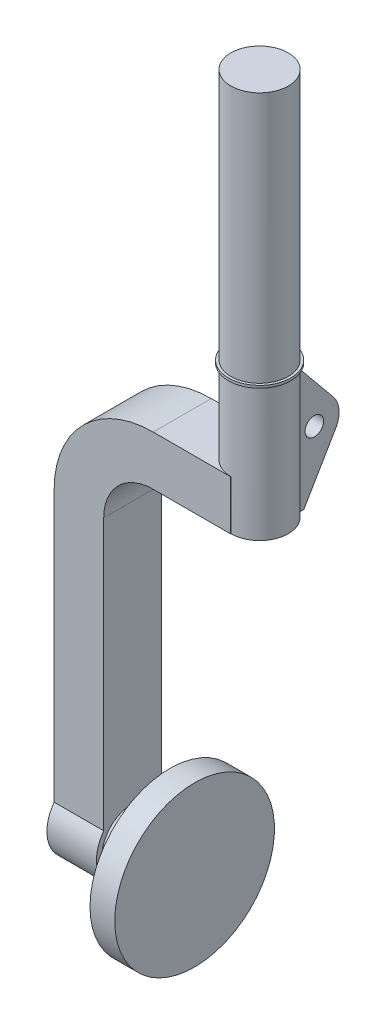
ISO-10303-21;
HEADER;
FILE_DESCRIPTION(('STEP AP214'),'2;1');
FILE_NAME('part.step','',(''),(''),'','','');
FILE_SCHEMA(('AUTOMOTIVE_DESIGN { 1 0 10303 214 1 1 1 1 }'));
ENDSEC;
DATA;
#1=APPLICATION_CONTEXT('core data for automotive mechanical design processes');
#2=APPLICATION_PROTOCOL_DEFINITION('international standard','automotive_design',2000,#1);
#3=PRODUCT_CONTEXT('',#1,'mechanical');
#4=PRODUCT('Part','Part','',(#3));
#5=PRODUCT_RELATED_PRODUCT_CATEGORY('part','',(#4));
#6=PRODUCT_DEFINITION_FORMATION('','',#4);
#7=PRODUCT_DEFINITION_CONTEXT('part definition',#1,'design');
#8=PRODUCT_DEFINITION('design','',#6,#7);
#9=PRODUCT_DEFINITION_SHAPE('','',#8);
#10=(LENGTH_UNIT() NAMED_UNIT(*) SI_UNIT(.MILLI.,.METRE.));
#11=(NAMED_UNIT(*) PLANE_ANGLE_UNIT() SI_UNIT($,.RADIAN.));
#12=(NAMED_UNIT(*) SI_UNIT($,.STERADIAN.) SOLID_ANGLE_UNIT());
#13=UNCERTAINTY_MEASURE_WITH_UNIT(LENGTH_MEASURE(1.E-05),#10,'distance_accuracy_value','');
#14=(GEOMETRIC_REPRESENTATION_CONTEXT(3) GLOBAL_UNCERTAINTY_ASSIGNED_CONTEXT((#13)) GLOBAL_UNIT_ASSIGNED_CONTEXT((#10,
#11,#12)) REPRESENTATION_CONTEXT('',''));
#15=CARTESIAN_POINT('',(0.,0.,0.));
#16=DIRECTION('',(0.,0.,1.));
#17=DIRECTION('',(1.,0.,0.));
#18=AXIS2_PLACEMENT_3D('',#15,#16,#17);
#19=CARTESIAN_POINT('',(15.8749999999999,200.9775,29.765625));
#20=DIRECTION('',(-1.,0.,0.));
#21=DIRECTION('',(0.,0.,1.));
#22=AXIS2_PLACEMENT_3D('',#19,#20,#21);
#23=PLANE('',#22);
#24=DIRECTION('',(0.,0.862458531784219,-0.506127731854923));
#25=VECTOR('',#24,1.);
#26=CARTESIAN_POINT('',(15.8749999999999,175.122928781159,-14.2914264711573));
#27=LINE('',#26,#25);
#28=CARTESIAN_POINT('',(15.8749999999999,200.9775,-29.464));
#29=VERTEX_POINT('',#28);
#30=CARTESIAN_POINT('',(15.8749999999999,201.491479057611,-29.765625));
#31=VERTEX_POINT('',#30);
#32=EDGE_CURVE('E187',#29,#31,#27,.T.);
#33=ORIENTED_EDGE('',*,*,#32,.F.);
#34=DIRECTION('',(0.,0.,-1.));
#35=VECTOR('',#34,1.);
#36=CARTESIAN_POINT('',(15.8749999999999,200.9775,29.765625));
#37=LINE('',#36,#35);
#38=CARTESIAN_POINT('',(15.8749999999999,200.9775,-29.765625));
#39=VERTEX_POINT('',#38);
#40=EDGE_CURVE('E155',#29,#39,#37,.T.);
#41=ORIENTED_EDGE('',*,*,#40,.T.);
#42=DIRECTION('',(0.,1.,0.));
#43=VECTOR('',#42,1.);
#44=CARTESIAN_POINT('',(15.8749999999999,200.9775,-29.765625));
#45=LINE('',#44,#43);
#46=EDGE_CURVE('E247',#39,#31,#45,.T.);
#47=ORIENTED_EDGE('',*,*,#46,.T.);
#48=EDGE_LOOP('',(#33,#41,#47));
#49=FACE_BOUND('',#48,.T.);
#50=ADVANCED_FACE('F36',(#49),#23,.F.);
#51=CARTESIAN_POINT('',(-63.5,150.1775,-29.765625));
#52=DIRECTION('',(0.,0.,-1.));
#53=DIRECTION('',(-1.,0.,0.));
#54=AXIS2_PLACEMENT_3D('',#51,#52,#53);
#55=PLANE('',#54);
#56=DIRECTION('',(-1.,0.,0.));
#57=VECTOR('',#56,1.);
#58=CARTESIAN_POINT('',(15.8749999999999,251.7775,-29.765625));
#59=LINE('',#58,#57);
#60=CARTESIAN_POINT('',(0.,251.7775,-29.765625));
#61=VERTEX_POINT('',#60);
#62=CARTESIAN_POINT('',(-63.5,251.7775,-29.765625));
#63=VERTEX_POINT('',#62);
#64=EDGE_CURVE('E250',#61,#63,#59,.T.);
#65=ORIENTED_EDGE('',*,*,#64,.F.);
#66=DIRECTION('',(0.,-1.,0.));
#67=VECTOR('',#66,1.);
#68=CARTESIAN_POINT('',(0.,150.1775,-29.765625));
#69=LINE('',#68,#67);
#70=CARTESIAN_POINT('',(0.,201.491479057611,-29.765625));
#71=VERTEX_POINT('',#70);
#72=EDGE_CURVE('E158',#61,#71,#69,.T.);
#73=ORIENTED_EDGE('',*,*,#72,.T.);
#74=DIRECTION('',(1.,0.,0.));
#75=VECTOR('',#74,1.);
#76=CARTESIAN_POINT('',(-63.5,201.491479057611,-29.765625));
#77=LINE('',#76,#75);
#78=EDGE_CURVE('E185',#71,#31,#77,.T.);
#79=ORIENTED_EDGE('',*,*,#78,.T.);
#80=ORIENTED_EDGE('',*,*,#46,.F.);
#81=DIRECTION('',(1.,0.,0.));
#82=VECTOR('',#81,1.);
#83=CARTESIAN_POINT('',(-63.5,200.9775,-29.765625));
#84=LINE('',#83,#82);
#85=CARTESIAN_POINT('',(-63.5,200.9775,-29.765625));
#86=VERTEX_POINT('',#85);
#87=EDGE_CURVE('E245',#86,#39,#84,.T.);
#88=ORIENTED_EDGE('',*,*,#87,.F.);
#89=CARTESIAN_POINT('',(-63.5,150.1775,-29.765625));
#90=DIRECTION('',(0.,0.,-1.));
#91=DIRECTION('',(-1.,0.,0.));
#92=AXIS2_PLACEMENT_3D('',#89,#90,#91);
#93=CIRCLE('',#92,50.8);
#94=CARTESIAN_POINT('',(-114.3,150.1775,-29.765625));
#95=VERTEX_POINT('',#94);
#96=EDGE_CURVE('E224',#95,#86,#93,.T.);
#97=ORIENTED_EDGE('',*,*,#96,.F.);
#98=DIRECTION('',(0.,1.,0.));
#99=VECTOR('',#98,1.);
#100=CARTESIAN_POINT('',(-114.3,-150.1775,-29.765625));
#101=LINE('',#100,#99);
#102=CARTESIAN_POINT('',(-114.3,-127.85328125,-29.765625));
#103=VERTEX_POINT('',#102);
#104=EDGE_CURVE('E229',#103,#95,#101,.T.);
#105=ORIENTED_EDGE('',*,*,#104,.F.);
#106=DIRECTION('',(-1.,0.,0.));
#107=VECTOR('',#106,1.);
#108=CARTESIAN_POINT('',(-165.1,-127.85328125,-29.765625));
#109=LINE('',#108,#107);
#110=CARTESIAN_POINT('',(-165.1,-127.85328125,-29.765625));
#111=VERTEX_POINT('',#110);
#112=EDGE_CURVE('E275',#103,#111,#109,.T.);
#113=ORIENTED_EDGE('',*,*,#112,.T.);
#114=DIRECTION('',(0.,-1.,0.));
#115=VECTOR('',#114,1.);
#116=CARTESIAN_POINT('',(-165.1,-150.1775,-29.765625));
#117=LINE('',#116,#115);
#118=CARTESIAN_POINT('',(-165.1,150.1775,-29.765625));
#119=VERTEX_POINT('',#118);
#120=EDGE_CURVE('E254',#119,#111,#117,.T.);
#121=ORIENTED_EDGE('',*,*,#120,.F.);
#122=CARTESIAN_POINT('',(-63.5,150.1775,-29.765625));
#123=DIRECTION('',(0.,0.,1.));
#124=DIRECTION('',(-1.,0.,0.));
#125=AXIS2_PLACEMENT_3D('',#122,#123,#124);
#126=CIRCLE('',#125,101.6);
#127=EDGE_CURVE('E252',#63,#119,#126,.T.);
#128=ORIENTED_EDGE('',*,*,#127,.F.);
#129=EDGE_LOOP('',(#65,#73,#79,#80,#88,#97,#105,#113,#121,#128));
#130=FACE_BOUND('',#129,.T.);
#131=ADVANCED_FACE('F297',(#130),#55,.T.);
#132=CARTESIAN_POINT('',(15.8749999999999,251.7775,29.765625));
#133=DIRECTION('',(0.,-1.,0.));
#134=DIRECTION('',(1.,0.,0.));
#135=AXIS2_PLACEMENT_3D('',#132,#133,#134);
#136=PLANE('',#135);
#137=DIRECTION('',(0.,0.,1.));
#138=VECTOR('',#137,1.);
#139=CARTESIAN_POINT('',(0.,251.7775,29.765625));
#140=LINE('',#139,#138);
#141=CARTESIAN_POINT('',(0.,251.7775,-24.8215968664387));
#142=VERTEX_POINT('',#141);
#143=EDGE_CURVE('E44',#61,#142,#140,.T.);
#144=ORIENTED_EDGE('',*,*,#143,.F.);
#145=ORIENTED_EDGE('',*,*,#64,.T.);
#146=DIRECTION('',(0.,0.,-1.));
#147=VECTOR('',#146,1.);
#148=CARTESIAN_POINT('',(-63.5,251.7775,29.765625));
#149=LINE('',#148,#147);
#150=CARTESIAN_POINT('',(-63.5,251.7775,29.765625));
#151=VERTEX_POINT('',#150);
#152=EDGE_CURVE('E263',#151,#63,#149,.T.);
#153=ORIENTED_EDGE('',*,*,#152,.F.);
#154=DIRECTION('',(-1.,0.,0.));
#155=VECTOR('',#154,1.);
#156=CARTESIAN_POINT('',(15.8749999999999,251.7775,29.765625));
#157=LINE('',#156,#155);
#158=CARTESIAN_POINT('',(15.8749999999999,251.7775,29.765625));
#159=VERTEX_POINT('',#158);
#160=EDGE_CURVE('E233',#159,#151,#157,.T.);
#161=ORIENTED_EDGE('',*,*,#160,.F.);
#162=DIRECTION('',(0.,0.,-1.));
#163=VECTOR('',#162,1.);
#164=CARTESIAN_POINT('',(15.8749999999999,251.7775,29.765625));
#165=LINE('',#164,#163);
#166=CARTESIAN_POINT('',(15.8749999999999,251.7775,29.464));
#167=VERTEX_POINT('',#166);
#168=EDGE_CURVE('E266',#159,#167,#165,.T.);
#169=ORIENTED_EDGE('',*,*,#168,.T.);
#170=CARTESIAN_POINT('',(15.8749999999999,251.7775,0.));
#171=DIRECTION('',(0.,-1.,0.));
#172=DIRECTION('',(1.,0.,0.));
#173=AXIS2_PLACEMENT_3D('',#170,#171,#172);
#174=CIRCLE('',#173,29.464);
#175=EDGE_CURVE('E278',#167,#142,#174,.T.);
#176=ORIENTED_EDGE('',*,*,#175,.T.);
#177=EDGE_LOOP('',(#144,#145,#153,#161,#169,#176));
#178=FACE_BOUND('',#177,.T.);
#179=ADVANCED_FACE('F293',(#178),#136,.F.);
#180=CARTESIAN_POINT('',(15.8749999999999,598.7415,0.));
#181=DIRECTION('',(0.,-1.,0.));
#182=DIRECTION('',(0.,0.,-1.));
#183=AXIS2_PLACEMENT_3D('',#180,#181,#182);
#184=CYLINDRICAL_SURFACE('',#183,29.464);
#185=DIRECTION('',(0.,-1.,0.));
#186=VECTOR('',#185,1.);
#187=CARTESIAN_POINT('',(31.7499999999999,598.7415,-24.8215968664387));
#188=LINE('',#187,#186);
#189=CARTESIAN_POINT('',(31.7499999999999,328.335545025308,-24.8215968664387));
#190=VERTEX_POINT('',#189);
#191=CARTESIAN_POINT('',(31.7499999999999,200.9775,-24.8215968664387));
#192=VERTEX_POINT('',#191);
#193=EDGE_CURVE('E54',#190,#192,#188,.T.);
#194=ORIENTED_EDGE('',*,*,#193,.F.);
#195=CARTESIAN_POINT('',(15.8749999999999,358.530673786115,0.));
#196=DIRECTION('',(0.,-0.635021305738295,0.772494622155022));
#197=DIRECTION('',(0.,-0.772494622155023,-0.635021305738295));
#198=AXIS2_PLACEMENT_3D('',#195,#196,#197);
#199=ELLIPSE('',#198,46.3984432234825,29.464);
#200=CARTESIAN_POINT('',(0.,328.335545025308,-24.8215968664387));
#201=VERTEX_POINT('',#200);
#202=EDGE_CURVE('E11',#190,#201,#199,.F.);
#203=ORIENTED_EDGE('',*,*,#202,.T.);
#204=DIRECTION('',(0.,-1.,0.));
#205=VECTOR('',#204,1.);
#206=CARTESIAN_POINT('',(0.,598.7415,-24.8215968664387));
#207=LINE('',#206,#205);
#208=EDGE_CURVE('E183',#201,#142,#207,.T.);
#209=ORIENTED_EDGE('',*,*,#208,.T.);
#210=ORIENTED_EDGE('',*,*,#175,.F.);
#211=DIRECTION('',(0.,-1.,0.));
#212=VECTOR('',#211,1.);
#213=CARTESIAN_POINT('',(15.8749999999999,598.7415,29.464));
#214=LINE('',#213,#212);
#215=CARTESIAN_POINT('',(15.8749999999999,200.9775,29.464));
#216=VERTEX_POINT('',#215);
#217=EDGE_CURVE('E200',#216,#167,#214,.F.);
#218=ORIENTED_EDGE('',*,*,#217,.F.);
#219=CARTESIAN_POINT('',(15.8749999999999,200.9775,0.));
#220=DIRECTION('',(0.,-1.,0.));
#221=DIRECTION('',(0.,0.,-1.));
#222=AXIS2_PLACEMENT_3D('',#219,#220,#221);
#223=CIRCLE('',#222,29.464);
#224=EDGE_CURVE('E201',#192,#216,#223,.T.);
#225=ORIENTED_EDGE('',*,*,#224,.F.);
#226=EDGE_LOOP('',(#194,#203,#209,#210,#218,#225));
#227=FACE_BOUND('',#226,.T.);
#228=CARTESIAN_POINT('',(15.8749999999999,338.1375,0.));
#229=DIRECTION('',(0.,1.,0.));
#230=DIRECTION('',(-1.,0.,0.));
#231=AXIS2_PLACEMENT_3D('',#228,#229,#230);
#232=CIRCLE('',#231,29.464);
#233=CARTESIAN_POINT('',(-13.5890000000001,338.1375,0.));
#234=VERTEX_POINT('',#233);
#235=EDGE_CURVE('E194',#234,#234,#232,.F.);
#236=ORIENTED_EDGE('',*,*,#235,.T.);
#237=EDGE_LOOP('',(#236));
#238=FACE_BOUND('',#237,.T.);
#239=ADVANCED_FACE('F318',(#227,#238),#184,.T.);
#240=CARTESIAN_POINT('',(-63.5,150.1775,29.765625));
#241=DIRECTION('',(0.,0.,-1.));
#242=DIRECTION('',(-1.,0.,0.));
#243=AXIS2_PLACEMENT_3D('',#240,#241,#242);
#244=PLANE('',#243);
#245=DIRECTION('',(-1.,0.,0.));
#246=VECTOR('',#245,1.);
#247=CARTESIAN_POINT('',(-165.1,-127.85328125,29.765625));
#248=LINE('',#247,#246);
#249=CARTESIAN_POINT('',(-114.3,-127.85328125,29.765625));
#250=VERTEX_POINT('',#249);
#251=CARTESIAN_POINT('',(-165.1,-127.85328125,29.765625));
#252=VERTEX_POINT('',#251);
#253=EDGE_CURVE('E222',#250,#252,#248,.T.);
#254=ORIENTED_EDGE('',*,*,#253,.F.);
#255=DIRECTION('',(0.,1.,0.));
#256=VECTOR('',#255,1.);
#257=CARTESIAN_POINT('',(-114.3,-150.1775,29.765625));
#258=LINE('',#257,#256);
#259=CARTESIAN_POINT('',(-114.3,150.1775,29.765625));
#260=VERTEX_POINT('',#259);
#261=EDGE_CURVE('E240',#250,#260,#258,.T.);
#262=ORIENTED_EDGE('',*,*,#261,.T.);
#263=CARTESIAN_POINT('',(-63.5,150.1775,29.765625));
#264=DIRECTION('',(0.,0.,-1.));
#265=DIRECTION('',(-1.,0.,0.));
#266=AXIS2_PLACEMENT_3D('',#263,#264,#265);
#267=CIRCLE('',#266,50.8);
#268=CARTESIAN_POINT('',(-63.5,200.9775,29.765625));
#269=VERTEX_POINT('',#268);
#270=EDGE_CURVE('E225',#260,#269,#267,.T.);
#271=ORIENTED_EDGE('',*,*,#270,.T.);
#272=DIRECTION('',(1.,0.,0.));
#273=VECTOR('',#272,1.);
#274=CARTESIAN_POINT('',(-63.5,200.9775,29.765625));
#275=LINE('',#274,#273);
#276=CARTESIAN_POINT('',(15.8749999999999,200.9775,29.765625));
#277=VERTEX_POINT('',#276);
#278=EDGE_CURVE('E228',#269,#277,#275,.T.);
#279=ORIENTED_EDGE('',*,*,#278,.T.);
#280=DIRECTION('',(0.,1.,0.));
#281=VECTOR('',#280,1.);
#282=CARTESIAN_POINT('',(15.8749999999999,200.9775,29.765625));
#283=LINE('',#282,#281);
#284=EDGE_CURVE('E231',#277,#159,#283,.T.);
#285=ORIENTED_EDGE('',*,*,#284,.T.);
#286=ORIENTED_EDGE('',*,*,#160,.T.);
#287=CARTESIAN_POINT('',(-63.5,150.1775,29.765625));
#288=DIRECTION('',(0.,0.,1.));
#289=DIRECTION('',(-1.,0.,0.));
#290=AXIS2_PLACEMENT_3D('',#287,#288,#289);
#291=CIRCLE('',#290,101.6);
#292=CARTESIAN_POINT('',(-165.1,150.1775,29.765625));
#293=VERTEX_POINT('',#292);
#294=EDGE_CURVE('E235',#151,#293,#291,.T.);
#295=ORIENTED_EDGE('',*,*,#294,.T.);
#296=DIRECTION('',(0.,-1.,0.));
#297=VECTOR('',#296,1.);
#298=CARTESIAN_POINT('',(-165.1,-150.1775,29.765625));
#299=LINE('',#298,#297);
#300=EDGE_CURVE('E237',#293,#252,#299,.T.);
#301=ORIENTED_EDGE('',*,*,#300,.T.);
#302=EDGE_LOOP('',(#254,#262,#271,#279,#285,#286,#295,#301));
#303=FACE_BOUND('',#302,.T.);
#304=ADVANCED_FACE('F309',(#303),#244,.F.);
#305=CARTESIAN_POINT('',(-63.5,150.1775,29.765625));
#306=DIRECTION('',(0.,0.,-1.));
#307=DIRECTION('',(-1.,0.,0.));
#308=AXIS2_PLACEMENT_3D('',#305,#306,#307);
#309=CYLINDRICAL_SURFACE('',#308,50.8);
#310=ORIENTED_EDGE('',*,*,#96,.T.);
#311=DIRECTION('',(0.,0.,-1.));
#312=VECTOR('',#311,1.);
#313=CARTESIAN_POINT('',(-63.5,200.9775,29.765625));
#314=LINE('',#313,#312);
#315=EDGE_CURVE('E272',#269,#86,#314,.T.);
#316=ORIENTED_EDGE('',*,*,#315,.F.);
#317=ORIENTED_EDGE('',*,*,#270,.F.);
#318=DIRECTION('',(0.,0.,-1.));
#319=VECTOR('',#318,1.);
#320=CARTESIAN_POINT('',(-114.3,150.1775,29.765625));
#321=LINE('',#320,#319);
#322=EDGE_CURVE('E242',#260,#95,#321,.T.);
#323=ORIENTED_EDGE('',*,*,#322,.T.);
#324=EDGE_LOOP('',(#310,#316,#317,#323));
#325=FACE_BOUND('',#324,.T.);
#326=ADVANCED_FACE('F38',(#325),#309,.F.);
#327=CARTESIAN_POINT('',(-63.5,200.9775,29.765625));
#328=DIRECTION('',(0.,1.,0.));
#329=DIRECTION('',(-1.,0.,0.));
#330=AXIS2_PLACEMENT_3D('',#327,#328,#329);
#331=PLANE('',#330);
#332=ORIENTED_EDGE('',*,*,#40,.F.);
#333=DIRECTION('',(-1.,0.,0.));
#334=VECTOR('',#333,1.);
#335=CARTESIAN_POINT('',(31.7499999999999,200.9775,-29.464));
#336=LINE('',#335,#334);
#337=CARTESIAN_POINT('',(31.7499999999999,200.9775,-29.464));
#338=VERTEX_POINT('',#337);
#339=EDGE_CURVE('E152',#338,#29,#336,.T.);
#340=ORIENTED_EDGE('',*,*,#339,.F.);
#341=DIRECTION('',(0.,0.,-1.));
#342=VECTOR('',#341,1.);
#343=CARTESIAN_POINT('',(31.7499999999999,200.9775,-29.464));
#344=LINE('',#343,#342);
#345=EDGE_CURVE('E139',#192,#338,#344,.T.);
#346=ORIENTED_EDGE('',*,*,#345,.F.);
#347=ORIENTED_EDGE('',*,*,#224,.T.);
#348=EDGE_CURVE('E269',#277,#216,#37,.T.);
#349=ORIENTED_EDGE('',*,*,#348,.F.);
#350=ORIENTED_EDGE('',*,*,#278,.F.);
#351=ORIENTED_EDGE('',*,*,#315,.T.);
#352=ORIENTED_EDGE('',*,*,#87,.T.);
#353=EDGE_LOOP('',(#332,#340,#346,#347,#349,#350,#351,#352));
#354=FACE_BOUND('',#353,.T.);
#355=ADVANCED_FACE('F153',(#354),#331,.F.);
#356=ORIENTED_EDGE('',*,*,#348,.T.);
#357=ORIENTED_EDGE('',*,*,#217,.T.);
#358=ORIENTED_EDGE('',*,*,#168,.F.);
#359=ORIENTED_EDGE('',*,*,#284,.F.);
#360=EDGE_LOOP('',(#356,#357,#358,#359));
#361=FACE_BOUND('',#360,.T.);
#362=ADVANCED_FACE('F315',(#361),#23,.F.);
#363=CARTESIAN_POINT('',(-63.5,150.1775,29.765625));
#364=DIRECTION('',(0.,0.,-1.));
#365=DIRECTION('',(-1.,0.,0.));
#366=AXIS2_PLACEMENT_3D('',#363,#364,#365);
#367=CYLINDRICAL_SURFACE('',#366,101.6);
#368=ORIENTED_EDGE('',*,*,#127,.T.);
#369=DIRECTION('',(0.,0.,-1.));
#370=VECTOR('',#369,1.);
#371=CARTESIAN_POINT('',(-165.1,150.1775,29.765625));
#372=LINE('',#371,#370);
#373=EDGE_CURVE('E260',#293,#119,#372,.T.);
#374=ORIENTED_EDGE('',*,*,#373,.F.);
#375=ORIENTED_EDGE('',*,*,#294,.F.);
#376=ORIENTED_EDGE('',*,*,#152,.T.);
#377=EDGE_LOOP('',(#368,#374,#375,#376));
#378=FACE_BOUND('',#377,.T.);
#379=ADVANCED_FACE('F302',(#378),#367,.T.);
#380=CARTESIAN_POINT('',(-165.1,-150.1775,29.765625));
#381=DIRECTION('',(1.,0.,0.));
#382=DIRECTION('',(0.,1.,0.));
#383=AXIS2_PLACEMENT_3D('',#380,#381,#382);
#384=PLANE('',#383);
#385=ORIENTED_EDGE('',*,*,#120,.T.);
#386=CARTESIAN_POINT('',(-165.1,-150.1775,0.));
#387=DIRECTION('',(-1.,0.,0.));
#388=DIRECTION('',(0.,0.,1.));
#389=AXIS2_PLACEMENT_3D('',#386,#387,#388);
#390=CIRCLE('',#389,37.20703125);
#391=EDGE_CURVE('E219',#111,#252,#390,.T.);
#392=ORIENTED_EDGE('',*,*,#391,.T.);
#393=ORIENTED_EDGE('',*,*,#300,.F.);
#394=ORIENTED_EDGE('',*,*,#373,.T.);
#395=EDGE_LOOP('',(#385,#392,#393,#394));
#396=FACE_BOUND('',#395,.T.);
#397=ADVANCED_FACE('F306',(#396),#384,.F.);
#398=CARTESIAN_POINT('',(-114.3,-150.1775,29.765625));
#399=DIRECTION('',(-1.,0.,0.));
#400=DIRECTION('',(0.,0.,1.));
#401=AXIS2_PLACEMENT_3D('',#398,#399,#400);
#402=PLANE('',#401);
#403=ORIENTED_EDGE('',*,*,#261,.F.);
#404=CARTESIAN_POINT('',(-114.3,-150.1775,0.));
#405=DIRECTION('',(-1.,0.,0.));
#406=DIRECTION('',(0.,0.,1.));
#407=AXIS2_PLACEMENT_3D('',#404,#405,#406);
#408=CIRCLE('',#407,37.20703125);
#409=EDGE_CURVE('E217',#103,#250,#408,.T.);
#410=ORIENTED_EDGE('',*,*,#409,.F.);
#411=ORIENTED_EDGE('',*,*,#104,.T.);
#412=ORIENTED_EDGE('',*,*,#322,.F.);
#413=EDGE_LOOP('',(#403,#410,#411,#412));
#414=FACE_BOUND('',#413,.T.);
#415=CARTESIAN_POINT('',(-114.3,-150.1775,0.));
#416=DIRECTION('',(-1.,0.,0.));
#417=DIRECTION('',(0.,0.,1.));
#418=AXIS2_PLACEMENT_3D('',#415,#416,#417);
#419=CIRCLE('',#418,31.75);
#420=CARTESIAN_POINT('',(-114.3,-150.1775,31.75));
#421=VERTEX_POINT('',#420);
#422=EDGE_CURVE('E214',#421,#421,#419,.T.);
#423=ORIENTED_EDGE('',*,*,#422,.T.);
#424=EDGE_LOOP('',(#423));
#425=FACE_BOUND('',#424,.T.);
#426=ADVANCED_FACE('F375',(#414,#425),#402,.F.);
#427=CARTESIAN_POINT('',(-165.1,-150.1775,0.));
#428=DIRECTION('',(-1.,0.,0.));
#429=DIRECTION('',(0.,0.,1.));
#430=AXIS2_PLACEMENT_3D('',#427,#428,#429);
#431=CYLINDRICAL_SURFACE('',#430,37.20703125);
#432=ORIENTED_EDGE('',*,*,#409,.T.);
#433=ORIENTED_EDGE('',*,*,#253,.T.);
#434=ORIENTED_EDGE('',*,*,#391,.F.);
#435=ORIENTED_EDGE('',*,*,#112,.F.);
#436=EDGE_LOOP('',(#432,#433,#434,#435));
#437=FACE_BOUND('',#436,.T.);
#438=ADVANCED_FACE('F372',(#437),#431,.T.);
#439=CARTESIAN_POINT('',(-165.1,-150.1775,0.));
#440=DIRECTION('',(-1.,0.,0.));
#441=DIRECTION('',(0.,0.,1.));
#442=AXIS2_PLACEMENT_3D('',#439,#440,#441);
#443=CYLINDRICAL_SURFACE('',#442,31.75);
#444=ORIENTED_EDGE('',*,*,#422,.F.);
#445=EDGE_LOOP('',(#444));
#446=FACE_BOUND('',#445,.T.);
#447=CARTESIAN_POINT('',(-76.2,-150.1775,0.));
#448=DIRECTION('',(-1.,0.,0.));
#449=DIRECTION('',(0.,0.,1.));
#450=AXIS2_PLACEMENT_3D('',#447,#448,#449);
#451=CIRCLE('',#450,31.75);
#452=CARTESIAN_POINT('',(-76.2,-150.1775,31.75));
#453=VERTEX_POINT('',#452);
#454=EDGE_CURVE('E211',#453,#453,#451,.T.);
#455=ORIENTED_EDGE('',*,*,#454,.T.);
#456=EDGE_LOOP('',(#455));
#457=FACE_BOUND('',#456,.T.);
#458=ADVANCED_FACE('F497',(#446,#457),#443,.T.);
#459=CARTESIAN_POINT('',(-76.2,-150.1775,31.75));
#460=DIRECTION('',(1.,0.,0.));
#461=DIRECTION('',(0.,0.,-1.));
#462=AXIS2_PLACEMENT_3D('',#459,#460,#461);
#463=PLANE('',#462);
#464=ORIENTED_EDGE('',*,*,#454,.F.);
#465=EDGE_LOOP('',(#464));
#466=FACE_BOUND('',#465,.T.);
#467=CARTESIAN_POINT('',(-76.2,-150.1775,0.));
#468=DIRECTION('',(-1.,0.,0.));
#469=DIRECTION('',(0.,0.,1.));
#470=AXIS2_PLACEMENT_3D('',#467,#468,#469);
#471=CIRCLE('',#470,81.915);
#472=CARTESIAN_POINT('',(-76.2,-150.1775,81.915));
#473=VERTEX_POINT('',#472);
#474=EDGE_CURVE('E208',#473,#473,#471,.T.);
#475=ORIENTED_EDGE('',*,*,#474,.T.);
#476=EDGE_LOOP('',(#475));
#477=FACE_BOUND('',#476,.T.);
#478=ADVANCED_FACE('F489',(#466,#477),#463,.F.);
#479=CARTESIAN_POINT('',(-165.1,-150.1775,0.));
#480=DIRECTION('',(-1.,0.,0.));
#481=DIRECTION('',(0.,0.,1.));
#482=AXIS2_PLACEMENT_3D('',#479,#480,#481);
#483=CYLINDRICAL_SURFACE('',#482,81.915);
#484=ORIENTED_EDGE('',*,*,#474,.F.);
#485=EDGE_LOOP('',(#484));
#486=FACE_BOUND('',#485,.T.);
#487=CARTESIAN_POINT('',(-50.8,-150.1775,0.));
#488=DIRECTION('',(-1.,0.,0.));
#489=DIRECTION('',(0.,0.,1.));
#490=AXIS2_PLACEMENT_3D('',#487,#488,#489);
#491=CIRCLE('',#490,81.915);
#492=CARTESIAN_POINT('',(-50.8,-150.1775,81.915));
#493=VERTEX_POINT('',#492);
#494=EDGE_CURVE('E205',#493,#493,#491,.T.);
#495=ORIENTED_EDGE('',*,*,#494,.T.);
#496=EDGE_LOOP('',(#495));
#497=FACE_BOUND('',#496,.T.);
#498=ADVANCED_FACE('F481',(#486,#497),#483,.T.);
#499=CARTESIAN_POINT('',(-50.8,-150.1775,81.915));
#500=DIRECTION('',(-1.,0.,0.));
#501=DIRECTION('',(0.,0.,1.));
#502=AXIS2_PLACEMENT_3D('',#499,#500,#501);
#503=PLANE('',#502);
#504=ORIENTED_EDGE('',*,*,#494,.F.);
#505=EDGE_LOOP('',(#504));
#506=FACE_BOUND('',#505,.T.);
#507=ADVANCED_FACE('F474',(#506),#503,.F.);
#508=CARTESIAN_POINT('',(15.8749999999998,338.1375,0.));
#509=DIRECTION('',(0.,1.,0.));
#510=DIRECTION('',(-1.,0.,0.));
#511=AXIS2_PLACEMENT_3D('',#508,#509,#510);
#512=CYLINDRICAL_SURFACE('',#511,32.0040000000003);
#513=CARTESIAN_POINT('',(15.8749999999998,338.1375,0.));
#514=DIRECTION('',(0.,1.,0.));
#515=DIRECTION('',(-1.,0.,0.));
#516=AXIS2_PLACEMENT_3D('',#513,#514,#515);
#517=CIRCLE('',#516,32.0040000000003);
#518=CARTESIAN_POINT('',(-16.1290000000005,338.1375,0.));
#519=VERTEX_POINT('',#518);
#520=EDGE_CURVE('E191',#519,#519,#517,.T.);
#521=ORIENTED_EDGE('',*,*,#520,.T.);
#522=EDGE_LOOP('',(#521));
#523=FACE_BOUND('',#522,.T.);
#524=CARTESIAN_POINT('',(15.8749999999998,340.6775,0.));
#525=DIRECTION('',(0.,1.,0.));
#526=DIRECTION('',(-1.,0.,0.));
#527=AXIS2_PLACEMENT_3D('',#524,#525,#526);
#528=CIRCLE('',#527,32.0040000000003);
#529=CARTESIAN_POINT('',(-16.1290000000005,340.6775,0.));
#530=VERTEX_POINT('',#529);
#531=EDGE_CURVE('E190',#530,#530,#528,.T.);
#532=ORIENTED_EDGE('',*,*,#531,.F.);
#533=EDGE_LOOP('',(#532));
#534=FACE_BOUND('',#533,.T.);
#535=ADVANCED_FACE('F467',(#523,#534),#512,.T.);
#536=CARTESIAN_POINT('',(15.8749999999998,338.1375,0.));
#537=DIRECTION('',(0.,1.,0.));
#538=DIRECTION('',(-1.,0.,0.));
#539=AXIS2_PLACEMENT_3D('',#536,#537,#538);
#540=PLANE('',#539);
#541=ORIENTED_EDGE('',*,*,#235,.F.);
#542=EDGE_LOOP('',(#541));
#543=FACE_BOUND('',#542,.T.);
#544=ORIENTED_EDGE('',*,*,#520,.F.);
#545=EDGE_LOOP('',(#544));
#546=FACE_BOUND('',#545,.T.);
#547=ADVANCED_FACE('F459',(#543,#546),#540,.F.);
#548=CARTESIAN_POINT('',(15.8749999999998,340.6775,0.));
#549=DIRECTION('',(0.,1.,0.));
#550=DIRECTION('',(-1.,0.,0.));
#551=AXIS2_PLACEMENT_3D('',#548,#549,#550);
#552=PLANE('',#551);
#553=CARTESIAN_POINT('',(15.8749999999999,340.6775,0.));
#554=DIRECTION('',(0.,1.,0.));
#555=DIRECTION('',(-1.,0.,0.));
#556=AXIS2_PLACEMENT_3D('',#553,#554,#555);
#557=CIRCLE('',#556,29.464);
#558=CARTESIAN_POINT('',(-13.5890000000001,340.6775,0.));
#559=VERTEX_POINT('',#558);
#560=EDGE_CURVE('E280',#559,#559,#557,.F.);
#561=ORIENTED_EDGE('',*,*,#560,.T.);
#562=EDGE_LOOP('',(#561));
#563=FACE_BOUND('',#562,.T.);
#564=ORIENTED_EDGE('',*,*,#531,.T.);
#565=EDGE_LOOP('',(#564));
#566=FACE_BOUND('',#565,.T.);
#567=ADVANCED_FACE('F452',(#563,#566),#552,.T.);
#568=CARTESIAN_POINT('',(15.8749999999999,598.7415,0.));
#569=DIRECTION('',(0.,-1.,0.));
#570=DIRECTION('',(0.,0.,-1.));
#571=AXIS2_PLACEMENT_3D('',#568,#569,#570);
#572=PLANE('',#571);
#573=CARTESIAN_POINT('',(15.8749999999999,598.7415,0.));
#574=DIRECTION('',(0.,-1.,0.));
#575=DIRECTION('',(0.,0.,-1.));
#576=AXIS2_PLACEMENT_3D('',#573,#574,#575);
#577=CIRCLE('',#576,29.464);
#578=CARTESIAN_POINT('',(15.8749999999999,598.7415,-29.464));
#579=VERTEX_POINT('',#578);
#580=EDGE_CURVE('E197',#579,#579,#577,.T.);
#581=ORIENTED_EDGE('',*,*,#580,.F.);
#582=EDGE_LOOP('',(#581));
#583=FACE_BOUND('',#582,.T.);
#584=ADVANCED_FACE('F444',(#583),#572,.F.);
#585=ORIENTED_EDGE('',*,*,#560,.F.);
#586=EDGE_LOOP('',(#585));
#587=FACE_BOUND('',#586,.T.);
#588=ORIENTED_EDGE('',*,*,#580,.T.);
#589=EDGE_LOOP('',(#588));
#590=FACE_BOUND('',#589,.T.);
#591=ADVANCED_FACE('F370',(#587,#590),#184,.T.);
#592=CARTESIAN_POINT('',(31.7499999999999,256.701855610885,-62.1654467073192));
#593=DIRECTION('',(0.,0.506127731854923,0.862458531784219));
#594=DIRECTION('',(0.,-0.862458531784219,0.506127731854923));
#595=AXIS2_PLACEMENT_3D('',#592,#593,#594);
#596=PLANE('',#595);
#597=ORIENTED_EDGE('',*,*,#339,.T.);
#598=ORIENTED_EDGE('',*,*,#32,.T.);
#599=ORIENTED_EDGE('',*,*,#78,.F.);
#600=DIRECTION('',(0.,0.862458531784219,-0.506127731854923));
#601=VECTOR('',#600,1.);
#602=CARTESIAN_POINT('',(0.,256.701855610885,-62.1654467073192));
#603=LINE('',#602,#601);
#604=CARTESIAN_POINT('',(0.,256.701855610885,-62.1654467073192));
#605=VERTEX_POINT('',#604);
#606=EDGE_CURVE('E172',#71,#605,#603,.T.);
#607=ORIENTED_EDGE('',*,*,#606,.T.);
#608=DIRECTION('',(-1.,0.,0.));
#609=VECTOR('',#608,1.);
#610=CARTESIAN_POINT('',(31.7499999999999,256.701855610885,-62.1654467073192));
#611=LINE('',#610,#609);
#612=CARTESIAN_POINT('',(31.7499999999999,256.701855610885,-62.1654467073192));
#613=VERTEX_POINT('',#612);
#614=EDGE_CURVE('E159',#613,#605,#611,.T.);
#615=ORIENTED_EDGE('',*,*,#614,.F.);
#616=DIRECTION('',(0.,0.862458531784219,-0.506127731854923));
#617=VECTOR('',#616,1.);
#618=CARTESIAN_POINT('',(31.7499999999999,256.701855610885,-62.1654467073192));
#619=LINE('',#618,#617);
#620=EDGE_CURVE('E145',#338,#613,#619,.T.);
#621=ORIENTED_EDGE('',*,*,#620,.F.);
#622=EDGE_LOOP('',(#597,#598,#599,#607,#615,#621));
#623=FACE_BOUND('',#622,.T.);
#624=ADVANCED_FACE('F161',(#623),#596,.F.);
#625=CARTESIAN_POINT('',(31.7499999999999,269.5575,-40.259));
#626=DIRECTION('',(1.,0.,0.));
#627=DIRECTION('',(0.,0.,-1.));
#628=AXIS2_PLACEMENT_3D('',#625,#626,#627);
#629=PLANE('',#628);
#630=DIRECTION('',(0.,0.772494622155022,0.635021305738295));
#631=VECTOR('',#630,1.);
#632=CARTESIAN_POINT('',(31.7499999999999,338.1375,-16.764));
#633=LINE('',#632,#631);
#634=CARTESIAN_POINT('',(31.7499999999999,285.687041165753,-59.8803634027375));
#635=VERTEX_POINT('',#634);
#636=EDGE_CURVE('E166',#635,#190,#633,.T.);
#637=ORIENTED_EDGE('',*,*,#636,.T.);
#638=ORIENTED_EDGE('',*,*,#193,.T.);
#639=ORIENTED_EDGE('',*,*,#345,.T.);
#640=ORIENTED_EDGE('',*,*,#620,.T.);
#641=CARTESIAN_POINT('',(31.7499999999999,269.5575,-40.259));
#642=DIRECTION('',(1.,0.,0.));
#643=DIRECTION('',(0.,0.,-1.));
#644=AXIS2_PLACEMENT_3D('',#641,#642,#643);
#645=CIRCLE('',#644,25.4);
#646=EDGE_CURVE('E164',#613,#635,#645,.T.);
#647=ORIENTED_EDGE('',*,*,#646,.T.);
#648=EDGE_LOOP('',(#637,#638,#639,#640,#647));
#649=FACE_BOUND('',#648,.T.);
#650=CARTESIAN_POINT('',(31.7499999999999,269.5575,-40.259));
#651=DIRECTION('',(1.,0.,0.));
#652=DIRECTION('',(0.,0.,-1.));
#653=AXIS2_PLACEMENT_3D('',#650,#651,#652);
#654=CIRCLE('',#653,9.525);
#655=CARTESIAN_POINT('',(31.7499999999999,269.5575,-49.784));
#656=VERTEX_POINT('',#655);
#657=EDGE_CURVE('E175',#656,#656,#654,.T.);
#658=ORIENTED_EDGE('',*,*,#657,.F.);
#659=EDGE_LOOP('',(#658));
#660=FACE_BOUND('',#659,.T.);
#661=ADVANCED_FACE('F142',(#649,#660),#629,.T.);
#662=CARTESIAN_POINT('',(0.,269.5575,-40.259));
#663=DIRECTION('',(1.,0.,0.));
#664=DIRECTION('',(0.,0.,-1.));
#665=AXIS2_PLACEMENT_3D('',#662,#663,#664);
#666=PLANE('',#665);
#667=ORIENTED_EDGE('',*,*,#208,.F.);
#668=DIRECTION('',(0.,0.772494622155022,0.635021305738295));
#669=VECTOR('',#668,1.);
#670=CARTESIAN_POINT('',(0.,338.1375,-16.764));
#671=LINE('',#670,#669);
#672=CARTESIAN_POINT('',(0.,285.687041165753,-59.8803634027375));
#673=VERTEX_POINT('',#672);
#674=EDGE_CURVE('E148',#673,#201,#671,.T.);
#675=ORIENTED_EDGE('',*,*,#674,.F.);
#676=CARTESIAN_POINT('',(0.,269.5575,-40.259));
#677=DIRECTION('',(1.,0.,0.));
#678=DIRECTION('',(0.,0.,-1.));
#679=AXIS2_PLACEMENT_3D('',#676,#677,#678);
#680=CIRCLE('',#679,25.4);
#681=EDGE_CURVE('E174',#605,#673,#680,.T.);
#682=ORIENTED_EDGE('',*,*,#681,.F.);
#683=ORIENTED_EDGE('',*,*,#606,.F.);
#684=ORIENTED_EDGE('',*,*,#72,.F.);
#685=ORIENTED_EDGE('',*,*,#143,.T.);
#686=EDGE_LOOP('',(#667,#675,#682,#683,#684,#685));
#687=FACE_BOUND('',#686,.T.);
#688=CARTESIAN_POINT('',(0.,269.5575,-40.259));
#689=DIRECTION('',(1.,0.,0.));
#690=DIRECTION('',(0.,0.,-1.));
#691=AXIS2_PLACEMENT_3D('',#688,#689,#690);
#692=CIRCLE('',#691,9.525);
#693=CARTESIAN_POINT('',(0.,269.5575,-49.784));
#694=VERTEX_POINT('',#693);
#695=EDGE_CURVE('E612',#694,#694,#692,.T.);
#696=ORIENTED_EDGE('',*,*,#695,.T.);
#697=EDGE_LOOP('',(#696));
#698=FACE_BOUND('',#697,.T.);
#699=ADVANCED_FACE('F287',(#687,#698),#666,.F.);
#700=CARTESIAN_POINT('',(31.7499999999999,269.5575,-40.259));
#701=DIRECTION('',(-1.,0.,0.));
#702=DIRECTION('',(0.,0.,1.));
#703=AXIS2_PLACEMENT_3D('',#700,#701,#702);
#704=CYLINDRICAL_SURFACE('',#703,25.4);
#705=ORIENTED_EDGE('',*,*,#681,.T.);
#706=DIRECTION('',(-1.,0.,0.));
#707=VECTOR('',#706,1.);
#708=CARTESIAN_POINT('',(31.7499999999999,285.687041165753,-59.8803634027375));
#709=LINE('',#708,#707);
#710=EDGE_CURVE('E171',#635,#673,#709,.T.);
#711=ORIENTED_EDGE('',*,*,#710,.F.);
#712=ORIENTED_EDGE('',*,*,#646,.F.);
#713=ORIENTED_EDGE('',*,*,#614,.T.);
#714=EDGE_LOOP('',(#705,#711,#712,#713));
#715=FACE_BOUND('',#714,.T.);
#716=ADVANCED_FACE('F331',(#715),#704,.T.);
#717=CARTESIAN_POINT('',(31.7499999999999,338.1375,-16.764));
#718=DIRECTION('',(0.,-0.635021305738295,0.772494622155022));
#719=DIRECTION('',(0.,-0.772494622155023,-0.635021305738295));
#720=AXIS2_PLACEMENT_3D('',#717,#718,#719);
#721=PLANE('',#720);
#722=ORIENTED_EDGE('',*,*,#202,.F.);
#723=ORIENTED_EDGE('',*,*,#636,.F.);
#724=ORIENTED_EDGE('',*,*,#710,.T.);
#725=ORIENTED_EDGE('',*,*,#674,.T.);
#726=EDGE_LOOP('',(#722,#723,#724,#725));
#727=FACE_BOUND('',#726,.T.);
#728=ADVANCED_FACE('F334',(#727),#721,.F.);
#729=CARTESIAN_POINT('',(31.7499999999999,269.5575,-40.259));
#730=DIRECTION('',(-1.,0.,0.));
#731=DIRECTION('',(0.,0.,1.));
#732=AXIS2_PLACEMENT_3D('',#729,#730,#731);
#733=CYLINDRICAL_SURFACE('',#732,9.525);
#734=ORIENTED_EDGE('',*,*,#657,.T.);
#735=EDGE_LOOP('',(#734));
#736=FACE_BOUND('',#735,.T.);
#737=ORIENTED_EDGE('',*,*,#695,.F.);
#738=EDGE_LOOP('',(#737));
#739=FACE_BOUND('',#738,.T.);
#740=ADVANCED_FACE('F336',(#736,#739),#733,.F.);
#741=CLOSED_SHELL('',(#50,#131,#179,#239,#304,#326,#355,#362,#379,#397,#426,#438,#458,#478,#498,
#507,#535,#547,#567,#584,#591,#624,#661,#699,#716,#728,#740));
#742=MANIFOLD_SOLID_BREP('B2',#741);
#743=ADVANCED_BREP_SHAPE_REPRESENTATION('',(#18,#742),#14);
#744=SHAPE_DEFINITION_REPRESENTATION(#9,#743);
ENDSEC;
END-ISO-10303-21;
